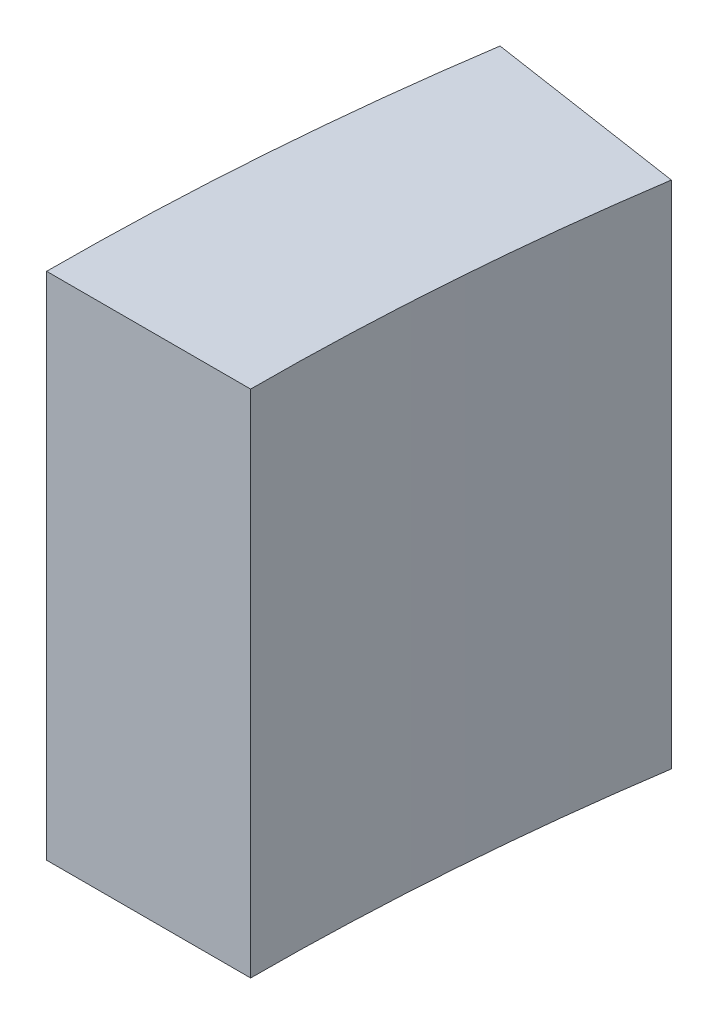
ISO-10303-21;
HEADER;
FILE_DESCRIPTION(('STEP AP214'),'2;1');
FILE_NAME('part.step','',(''),(''),'','','');
FILE_SCHEMA(('AUTOMOTIVE_DESIGN { 1 0 10303 214 1 1 1 1 }'));
ENDSEC;
DATA;
#1=APPLICATION_CONTEXT('core data for automotive mechanical design processes');
#2=APPLICATION_PROTOCOL_DEFINITION('international standard','automotive_design',2000,#1);
#3=PRODUCT_CONTEXT('',#1,'mechanical');
#4=PRODUCT('Part','Part','',(#3));
#5=PRODUCT_RELATED_PRODUCT_CATEGORY('part','',(#4));
#6=PRODUCT_DEFINITION_FORMATION('','',#4);
#7=PRODUCT_DEFINITION_CONTEXT('part definition',#1,'design');
#8=PRODUCT_DEFINITION('design','',#6,#7);
#9=PRODUCT_DEFINITION_SHAPE('','',#8);
#10=(LENGTH_UNIT() NAMED_UNIT(*) SI_UNIT(.MILLI.,.METRE.));
#11=(NAMED_UNIT(*) PLANE_ANGLE_UNIT() SI_UNIT($,.RADIAN.));
#12=(NAMED_UNIT(*) SI_UNIT($,.STERADIAN.) SOLID_ANGLE_UNIT());
#13=UNCERTAINTY_MEASURE_WITH_UNIT(LENGTH_MEASURE(1.E-05),#10,'distance_accuracy_value','');
#14=(GEOMETRIC_REPRESENTATION_CONTEXT(3) GLOBAL_UNCERTAINTY_ASSIGNED_CONTEXT((#13)) GLOBAL_UNIT_ASSIGNED_CONTEXT((#10,
#11,#12)) REPRESENTATION_CONTEXT('',''));
#15=CARTESIAN_POINT('',(0.,0.,0.));
#16=DIRECTION('',(0.,0.,1.));
#17=DIRECTION('',(1.,0.,0.));
#18=AXIS2_PLACEMENT_3D('',#15,#16,#17);
#19=CARTESIAN_POINT('',(0.,10.,0.));
#20=DIRECTION('',(0.,1.,0.));
#21=DIRECTION('',(0.,0.,1.));
#22=AXIS2_PLACEMENT_3D('',#19,#20,#21);
#23=PLANE('',#22);
#24=DIRECTION('',(0.988834542029579,0.,0.149017611338903));
#25=VECTOR('',#24,1.);
#26=CARTESIAN_POINT('',(0.,10.,0.));
#27=LINE('',#26,#25);
#28=CARTESIAN_POINT('',(-54.8803170826417,10.,-8.27047742930911));
#29=VERTEX_POINT('',#28);
#30=CARTESIAN_POINT('',(-50.9249789145233,10.,-7.6744069839535));
#31=VERTEX_POINT('',#30);
#32=EDGE_CURVE('E59',#29,#31,#27,.T.);
#33=ORIENTED_EDGE('',*,*,#32,.F.);
#34=CARTESIAN_POINT('',(0.,10.,0.));
#35=DIRECTION('',(0.,1.,0.));
#36=DIRECTION('',(0.,0.,1.));
#37=AXIS2_PLACEMENT_3D('',#34,#35,#36);
#38=CIRCLE('',#37,55.5);
#39=CARTESIAN_POINT('',(-55.5,10.,0.));
#40=VERTEX_POINT('',#39);
#41=EDGE_CURVE('E90',#29,#40,#38,.T.);
#42=ORIENTED_EDGE('',*,*,#41,.T.);
#43=DIRECTION('',(-1.,0.,0.));
#44=VECTOR('',#43,1.);
#45=CARTESIAN_POINT('',(0.,10.,0.));
#46=LINE('',#45,#44);
#47=CARTESIAN_POINT('',(-51.5,10.,0.));
#48=VERTEX_POINT('',#47);
#49=EDGE_CURVE('E93',#48,#40,#46,.T.);
#50=ORIENTED_EDGE('',*,*,#49,.F.);
#51=CARTESIAN_POINT('',(0.,10.,0.));
#52=DIRECTION('',(0.,1.,0.));
#53=DIRECTION('',(0.,0.,1.));
#54=AXIS2_PLACEMENT_3D('',#51,#52,#53);
#55=CIRCLE('',#54,51.5);
#56=EDGE_CURVE('E92',#31,#48,#55,.T.);
#57=ORIENTED_EDGE('',*,*,#56,.F.);
#58=EDGE_LOOP('',(#33,#42,#50,#57));
#59=FACE_BOUND('',#58,.T.);
#60=ADVANCED_FACE('F37',(#59),#23,.T.);
#61=CARTESIAN_POINT('',(0.,0.,0.));
#62=DIRECTION('',(0.,1.,0.));
#63=DIRECTION('',(0.,0.,1.));
#64=AXIS2_PLACEMENT_3D('',#61,#62,#63);
#65=PLANE('',#64);
#66=CARTESIAN_POINT('',(0.,0.,0.));
#67=DIRECTION('',(0.,1.,0.));
#68=DIRECTION('',(0.,0.,1.));
#69=AXIS2_PLACEMENT_3D('',#66,#67,#68);
#70=CIRCLE('',#69,55.5);
#71=CARTESIAN_POINT('',(-54.8803170826417,0.,-8.27047742930911));
#72=VERTEX_POINT('',#71);
#73=CARTESIAN_POINT('',(-55.5,0.,0.));
#74=VERTEX_POINT('',#73);
#75=EDGE_CURVE('E96',#72,#74,#70,.T.);
#76=ORIENTED_EDGE('',*,*,#75,.F.);
#77=DIRECTION('',(0.988834542029579,0.,0.149017611338903));
#78=VECTOR('',#77,1.);
#79=CARTESIAN_POINT('',(0.,0.,0.));
#80=LINE('',#79,#78);
#81=CARTESIAN_POINT('',(-50.9249789145233,0.,-7.6744069839535));
#82=VERTEX_POINT('',#81);
#83=EDGE_CURVE('E78',#72,#82,#80,.T.);
#84=ORIENTED_EDGE('',*,*,#83,.T.);
#85=CARTESIAN_POINT('',(0.,0.,0.));
#86=DIRECTION('',(0.,1.,0.));
#87=DIRECTION('',(0.,0.,1.));
#88=AXIS2_PLACEMENT_3D('',#85,#86,#87);
#89=CIRCLE('',#88,51.5);
#90=CARTESIAN_POINT('',(-51.5,0.,0.));
#91=VERTEX_POINT('',#90);
#92=EDGE_CURVE('E83',#82,#91,#89,.T.);
#93=ORIENTED_EDGE('',*,*,#92,.T.);
#94=DIRECTION('',(-1.,0.,0.));
#95=VECTOR('',#94,1.);
#96=CARTESIAN_POINT('',(0.,0.,0.));
#97=LINE('',#96,#95);
#98=EDGE_CURVE('E52',#91,#74,#97,.T.);
#99=ORIENTED_EDGE('',*,*,#98,.T.);
#100=EDGE_LOOP('',(#76,#84,#93,#99));
#101=FACE_BOUND('',#100,.T.);
#102=ADVANCED_FACE('F108',(#101),#65,.F.);
#103=CARTESIAN_POINT('',(0.,10.,0.));
#104=DIRECTION('',(0.,-1.,0.));
#105=DIRECTION('',(0.,0.,-1.));
#106=AXIS2_PLACEMENT_3D('',#103,#104,#105);
#107=CYLINDRICAL_SURFACE('',#106,55.5);
#108=ORIENTED_EDGE('',*,*,#41,.F.);
#109=DIRECTION('',(0.,-1.,0.));
#110=VECTOR('',#109,1.);
#111=CARTESIAN_POINT('',(-54.8803170826417,10.,-8.27047742930911));
#112=LINE('',#111,#110);
#113=EDGE_CURVE('E75',#29,#72,#112,.T.);
#114=ORIENTED_EDGE('',*,*,#113,.T.);
#115=ORIENTED_EDGE('',*,*,#75,.T.);
#116=DIRECTION('',(0.,-1.,0.));
#117=VECTOR('',#116,1.);
#118=CARTESIAN_POINT('',(-55.5,10.,0.));
#119=LINE('',#118,#117);
#120=EDGE_CURVE('E84',#74,#40,#119,.F.);
#121=ORIENTED_EDGE('',*,*,#120,.T.);
#122=EDGE_LOOP('',(#108,#114,#115,#121));
#123=FACE_BOUND('',#122,.T.);
#124=ADVANCED_FACE('F39',(#123),#107,.T.);
#125=CARTESIAN_POINT('',(0.,10.,0.));
#126=DIRECTION('',(0.,-1.,0.));
#127=DIRECTION('',(0.,0.,-1.));
#128=AXIS2_PLACEMENT_3D('',#125,#126,#127);
#129=CYLINDRICAL_SURFACE('',#128,51.5);
#130=DIRECTION('',(0.,-1.,0.));
#131=VECTOR('',#130,1.);
#132=CARTESIAN_POINT('',(-50.9249789145233,10.,-7.6744069839535));
#133=LINE('',#132,#131);
#134=EDGE_CURVE('E11',#31,#82,#133,.T.);
#135=ORIENTED_EDGE('',*,*,#134,.F.);
#136=ORIENTED_EDGE('',*,*,#56,.T.);
#137=DIRECTION('',(0.,-1.,0.));
#138=VECTOR('',#137,1.);
#139=CARTESIAN_POINT('',(-51.5,10.,0.));
#140=LINE('',#139,#138);
#141=EDGE_CURVE('E45',#91,#48,#140,.F.);
#142=ORIENTED_EDGE('',*,*,#141,.F.);
#143=ORIENTED_EDGE('',*,*,#92,.F.);
#144=EDGE_LOOP('',(#135,#136,#142,#143));
#145=FACE_BOUND('',#144,.T.);
#146=ADVANCED_FACE('F110',(#145),#129,.F.);
#147=CARTESIAN_POINT('',(0.,0.,0.));
#148=DIRECTION('',(0.,0.,-1.));
#149=DIRECTION('',(-1.,0.,0.));
#150=AXIS2_PLACEMENT_3D('',#147,#148,#149);
#151=PLANE('',#150);
#152=ORIENTED_EDGE('',*,*,#98,.F.);
#153=ORIENTED_EDGE('',*,*,#141,.T.);
#154=ORIENTED_EDGE('',*,*,#49,.T.);
#155=ORIENTED_EDGE('',*,*,#120,.F.);
#156=EDGE_LOOP('',(#152,#153,#154,#155));
#157=FACE_BOUND('',#156,.T.);
#158=ADVANCED_FACE('F111',(#157),#151,.F.);
#159=CARTESIAN_POINT('',(0.,0.,0.));
#160=DIRECTION('',(-0.149017611338903,0.,0.988834542029579));
#161=DIRECTION('',(0.988834542029579,0.,0.149017611338903));
#162=AXIS2_PLACEMENT_3D('',#159,#160,#161);
#163=PLANE('',#162);
#164=ORIENTED_EDGE('',*,*,#32,.T.);
#165=ORIENTED_EDGE('',*,*,#134,.T.);
#166=ORIENTED_EDGE('',*,*,#83,.F.);
#167=ORIENTED_EDGE('',*,*,#113,.F.);
#168=EDGE_LOOP('',(#164,#165,#166,#167));
#169=FACE_BOUND('',#168,.T.);
#170=ADVANCED_FACE('F76',(#169),#163,.F.);
#171=CLOSED_SHELL('',(#60,#102,#124,#146,#158,#170));
#172=MANIFOLD_SOLID_BREP('B2',#171);
#173=ADVANCED_BREP_SHAPE_REPRESENTATION('',(#18,#172),#14);
#174=SHAPE_DEFINITION_REPRESENTATION(#9,#173);
ENDSEC;
END-ISO-10303-21;
